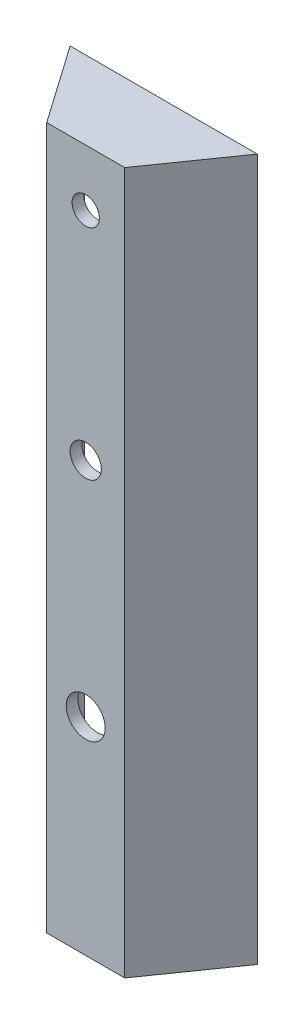
ISO-10303-21;
HEADER;
FILE_DESCRIPTION(('STEP AP214'),'2;1');
FILE_NAME('part.step','',(''),(''),'','','');
FILE_SCHEMA(('AUTOMOTIVE_DESIGN { 1 0 10303 214 1 1 1 1 }'));
ENDSEC;
DATA;
#1=APPLICATION_CONTEXT('core data for automotive mechanical design processes');
#2=APPLICATION_PROTOCOL_DEFINITION('international standard','automotive_design',2000,#1);
#3=PRODUCT_CONTEXT('',#1,'mechanical');
#4=PRODUCT('Part','Part','',(#3));
#5=PRODUCT_RELATED_PRODUCT_CATEGORY('part','',(#4));
#6=PRODUCT_DEFINITION_FORMATION('','',#4);
#7=PRODUCT_DEFINITION_CONTEXT('part definition',#1,'design');
#8=PRODUCT_DEFINITION('design','',#6,#7);
#9=PRODUCT_DEFINITION_SHAPE('','',#8);
#10=(LENGTH_UNIT() NAMED_UNIT(*) SI_UNIT(.MILLI.,.METRE.));
#11=(NAMED_UNIT(*) PLANE_ANGLE_UNIT() SI_UNIT($,.RADIAN.));
#12=(NAMED_UNIT(*) SI_UNIT($,.STERADIAN.) SOLID_ANGLE_UNIT());
#13=UNCERTAINTY_MEASURE_WITH_UNIT(LENGTH_MEASURE(1.E-05),#10,'distance_accuracy_value','');
#14=(GEOMETRIC_REPRESENTATION_CONTEXT(3) GLOBAL_UNCERTAINTY_ASSIGNED_CONTEXT((#13)) GLOBAL_UNIT_ASSIGNED_CONTEXT((#10,
#11,#12)) REPRESENTATION_CONTEXT('',''));
#15=CARTESIAN_POINT('',(0.,0.,0.));
#16=DIRECTION('',(0.,0.,1.));
#17=DIRECTION('',(1.,0.,0.));
#18=AXIS2_PLACEMENT_3D('',#15,#16,#17);
#19=CARTESIAN_POINT('',(-304.8,2286.,0.));
#20=DIRECTION('',(0.,0.,1.));
#21=DIRECTION('',(1.,0.,0.));
#22=AXIS2_PLACEMENT_3D('',#19,#20,#21);
#23=PLANE('',#22);
#24=DIRECTION('',(-1.,0.,0.));
#25=VECTOR('',#24,1.);
#26=CARTESIAN_POINT('',(-304.8,0.,0.));
#27=LINE('',#26,#25);
#28=CARTESIAN_POINT('',(304.8,0.,-1.11981703314034E-13));
#29=VERTEX_POINT('',#28);
#30=CARTESIAN_POINT('',(-304.8,0.,0.));
#31=VERTEX_POINT('',#30);
#32=EDGE_CURVE('E187',#29,#31,#27,.T.);
#33=ORIENTED_EDGE('',*,*,#32,.T.);
#34=DIRECTION('',(0.,-1.,0.));
#35=VECTOR('',#34,1.);
#36=CARTESIAN_POINT('',(-304.8,2286.,0.));
#37=LINE('',#36,#35);
#38=CARTESIAN_POINT('',(-304.8,2286.,0.));
#39=VERTEX_POINT('',#38);
#40=EDGE_CURVE('E49',#39,#31,#37,.T.);
#41=ORIENTED_EDGE('',*,*,#40,.F.);
#42=DIRECTION('',(-1.,0.,0.));
#43=VECTOR('',#42,1.);
#44=CARTESIAN_POINT('',(-304.8,2286.,0.));
#45=LINE('',#44,#43);
#46=CARTESIAN_POINT('',(304.8,2286.,-1.11981703314034E-13));
#47=VERTEX_POINT('',#46);
#48=EDGE_CURVE('E94',#47,#39,#45,.T.);
#49=ORIENTED_EDGE('',*,*,#48,.F.);
#50=DIRECTION('',(0.,-1.,0.));
#51=VECTOR('',#50,1.);
#52=CARTESIAN_POINT('',(304.8,2286.,-1.11981703314034E-13));
#53=LINE('',#52,#51);
#54=EDGE_CURVE('E11',#47,#29,#53,.T.);
#55=ORIENTED_EDGE('',*,*,#54,.T.);
#56=EDGE_LOOP('',(#33,#41,#49,#55));
#57=FACE_BOUND('',#56,.T.);
#58=DIRECTION('',(-1.,0.,0.));
#59=VECTOR('',#58,1.);
#60=CARTESIAN_POINT('',(0.,38.1,0.));
#61=LINE('',#60,#59);
#62=CARTESIAN_POINT('',(258.293023104055,38.1,-1.03438510254988E-13));
#63=VERTEX_POINT('',#62);
#64=CARTESIAN_POINT('',(-258.293023104055,38.1,0.));
#65=VERTEX_POINT('',#64);
#66=EDGE_CURVE('E141',#63,#65,#61,.T.);
#67=ORIENTED_EDGE('',*,*,#66,.F.);
#68=DIRECTION('',(0.,-1.,0.));
#69=VECTOR('',#68,1.);
#70=CARTESIAN_POINT('',(258.293023104055,2286.,-1.03438510254988E-13));
#71=LINE('',#70,#69);
#72=CARTESIAN_POINT('',(258.293023104055,2247.9,-1.03438510254988E-13));
#73=VERTEX_POINT('',#72);
#74=EDGE_CURVE('E139',#73,#63,#71,.T.);
#75=ORIENTED_EDGE('',*,*,#74,.F.);
#76=DIRECTION('',(-1.,0.,0.));
#77=VECTOR('',#76,1.);
#78=CARTESIAN_POINT('',(0.,2247.9,0.));
#79=LINE('',#78,#77);
#80=CARTESIAN_POINT('',(-258.293023104055,2247.9,0.));
#81=VERTEX_POINT('',#80);
#82=EDGE_CURVE('E152',#73,#81,#79,.T.);
#83=ORIENTED_EDGE('',*,*,#82,.T.);
#84=DIRECTION('',(0.,-1.,0.));
#85=VECTOR('',#84,1.);
#86=CARTESIAN_POINT('',(-258.293023104055,2286.,0.));
#87=LINE('',#86,#85);
#88=EDGE_CURVE('E159',#81,#65,#87,.T.);
#89=ORIENTED_EDGE('',*,*,#88,.T.);
#90=EDGE_LOOP('',(#67,#75,#83,#89));
#91=FACE_BOUND('',#90,.T.);
#92=ADVANCED_FACE('F39',(#57,#91),#23,.F.);
#93=CARTESIAN_POINT('',(304.8,2286.,-1.11981703314034E-13));
#94=DIRECTION('',(-0.819231920519041,0.,-0.573462344363328));
#95=DIRECTION('',(-0.573462344363328,0.,0.819231920519041));
#96=AXIS2_PLACEMENT_3D('',#93,#94,#95);
#97=PLANE('',#96);
#98=DIRECTION('',(0.573462344363328,0.,-0.819231920519041));
#99=VECTOR('',#98,1.);
#100=CARTESIAN_POINT('',(304.8,0.,-1.11981703314034E-13));
#101=LINE('',#100,#99);
#102=CARTESIAN_POINT('',(127.,0.,254.));
#103=VERTEX_POINT('',#102);
#104=EDGE_CURVE('E165',#103,#29,#101,.T.);
#105=ORIENTED_EDGE('',*,*,#104,.T.);
#106=ORIENTED_EDGE('',*,*,#54,.F.);
#107=DIRECTION('',(0.573462344363328,0.,-0.819231920519041));
#108=VECTOR('',#107,1.);
#109=CARTESIAN_POINT('',(304.8,2286.,-1.11981703314034E-13));
#110=LINE('',#109,#108);
#111=CARTESIAN_POINT('',(127.,2286.,254.));
#112=VERTEX_POINT('',#111);
#113=EDGE_CURVE('E173',#112,#47,#110,.T.);
#114=ORIENTED_EDGE('',*,*,#113,.F.);
#115=DIRECTION('',(0.,-1.,0.));
#116=VECTOR('',#115,1.);
#117=CARTESIAN_POINT('',(127.,2286.,254.));
#118=LINE('',#117,#116);
#119=EDGE_CURVE('E183',#112,#103,#118,.T.);
#120=ORIENTED_EDGE('',*,*,#119,.T.);
#121=EDGE_LOOP('',(#105,#106,#114,#120));
#122=FACE_BOUND('',#121,.T.);
#123=ADVANCED_FACE('F41',(#122),#97,.F.);
#124=CARTESIAN_POINT('',(-127.,2286.,254.));
#125=DIRECTION('',(0.81923192051904,0.,-0.573462344363328));
#126=DIRECTION('',(-0.573462344363328,0.,-0.81923192051904));
#127=AXIS2_PLACEMENT_3D('',#124,#125,#126);
#128=PLANE('',#127);
#129=DIRECTION('',(0.573462344363328,0.,0.81923192051904));
#130=VECTOR('',#129,1.);
#131=CARTESIAN_POINT('',(-127.,0.,254.));
#132=LINE('',#131,#130);
#133=CARTESIAN_POINT('',(-127.,0.,254.));
#134=VERTEX_POINT('',#133);
#135=EDGE_CURVE('E190',#31,#134,#132,.T.);
#136=ORIENTED_EDGE('',*,*,#135,.T.);
#137=DIRECTION('',(0.,-1.,0.));
#138=VECTOR('',#137,1.);
#139=CARTESIAN_POINT('',(-127.,2286.,254.));
#140=LINE('',#139,#138);
#141=CARTESIAN_POINT('',(-127.,2286.,254.));
#142=VERTEX_POINT('',#141);
#143=EDGE_CURVE('E197',#142,#134,#140,.T.);
#144=ORIENTED_EDGE('',*,*,#143,.F.);
#145=DIRECTION('',(0.573462344363328,0.,0.81923192051904));
#146=VECTOR('',#145,1.);
#147=CARTESIAN_POINT('',(-127.,2286.,254.));
#148=LINE('',#147,#146);
#149=EDGE_CURVE('E178',#39,#142,#148,.T.);
#150=ORIENTED_EDGE('',*,*,#149,.F.);
#151=ORIENTED_EDGE('',*,*,#40,.T.);
#152=EDGE_LOOP('',(#136,#144,#150,#151));
#153=FACE_BOUND('',#152,.T.);
#154=ADVANCED_FACE('F240',(#153),#128,.F.);
#155=CARTESIAN_POINT('',(127.,2286.,254.));
#156=DIRECTION('',(0.,0.,-1.));
#157=DIRECTION('',(-1.,0.,0.));
#158=AXIS2_PLACEMENT_3D('',#155,#156,#157);
#159=PLANE('',#158);
#160=CARTESIAN_POINT('',(0.,2101.85,254.));
#161=DIRECTION('',(0.,0.,-1.));
#162=DIRECTION('',(-1.,0.,0.));
#163=AXIS2_PLACEMENT_3D('',#160,#161,#162);
#164=CIRCLE('',#163,44.4500000000002);
#165=CARTESIAN_POINT('',(-44.4500000000001,2101.85,254.));
#166=VERTEX_POINT('',#165);
#167=EDGE_CURVE('E142',#166,#166,#164,.T.);
#168=ORIENTED_EDGE('',*,*,#167,.T.);
#169=EDGE_LOOP('',(#168));
#170=FACE_BOUND('',#169,.T.);
#171=CARTESIAN_POINT('',(1.64382251675458E-13,1397.,254.));
#172=DIRECTION('',(0.,0.,-1.));
#173=DIRECTION('',(-1.,0.,0.));
#174=AXIS2_PLACEMENT_3D('',#171,#172,#173);
#175=CIRCLE('',#174,50.8);
#176=CARTESIAN_POINT('',(-50.7999999999998,1397.,254.));
#177=VERTEX_POINT('',#176);
#178=EDGE_CURVE('E210',#177,#177,#175,.T.);
#179=ORIENTED_EDGE('',*,*,#178,.T.);
#180=EDGE_LOOP('',(#179));
#181=FACE_BOUND('',#180,.T.);
#182=CARTESIAN_POINT('',(2.53034433465734E-13,673.1,254.));
#183=DIRECTION('',(0.,0.,-1.));
#184=DIRECTION('',(-1.,0.,0.));
#185=AXIS2_PLACEMENT_3D('',#182,#183,#184);
#186=CIRCLE('',#185,63.5);
#187=CARTESIAN_POINT('',(-63.4999999999998,673.1,254.));
#188=VERTEX_POINT('',#187);
#189=EDGE_CURVE('E206',#188,#188,#186,.T.);
#190=ORIENTED_EDGE('',*,*,#189,.T.);
#191=EDGE_LOOP('',(#190));
#192=FACE_BOUND('',#191,.T.);
#193=DIRECTION('',(1.,0.,0.));
#194=VECTOR('',#193,1.);
#195=CARTESIAN_POINT('',(127.,0.,254.));
#196=LINE('',#195,#194);
#197=EDGE_CURVE('E87',#134,#103,#196,.T.);
#198=ORIENTED_EDGE('',*,*,#197,.T.);
#199=ORIENTED_EDGE('',*,*,#119,.F.);
#200=DIRECTION('',(1.,0.,0.));
#201=VECTOR('',#200,1.);
#202=CARTESIAN_POINT('',(127.,2286.,254.));
#203=LINE('',#202,#201);
#204=EDGE_CURVE('E66',#142,#112,#203,.T.);
#205=ORIENTED_EDGE('',*,*,#204,.F.);
#206=ORIENTED_EDGE('',*,*,#143,.T.);
#207=EDGE_LOOP('',(#198,#199,#205,#206));
#208=FACE_BOUND('',#207,.T.);
#209=ADVANCED_FACE('F220',(#170,#181,#192,#208),#159,.F.);
#210=CARTESIAN_POINT('',(0.,2286.,0.));
#211=DIRECTION('',(0.,-1.,0.));
#212=DIRECTION('',(0.,0.,-1.));
#213=AXIS2_PLACEMENT_3D('',#210,#211,#212);
#214=PLANE('',#213);
#215=ORIENTED_EDGE('',*,*,#113,.T.);
#216=ORIENTED_EDGE('',*,*,#48,.T.);
#217=ORIENTED_EDGE('',*,*,#149,.T.);
#218=ORIENTED_EDGE('',*,*,#204,.T.);
#219=EDGE_LOOP('',(#215,#216,#217,#218));
#220=FACE_BOUND('',#219,.T.);
#221=ADVANCED_FACE('F249',(#220),#214,.F.);
#222=CARTESIAN_POINT('',(0.,0.,0.));
#223=DIRECTION('',(0.,-1.,0.));
#224=DIRECTION('',(0.,0.,-1.));
#225=AXIS2_PLACEMENT_3D('',#222,#223,#224);
#226=PLANE('',#225);
#227=ORIENTED_EDGE('',*,*,#104,.F.);
#228=ORIENTED_EDGE('',*,*,#197,.F.);
#229=ORIENTED_EDGE('',*,*,#135,.F.);
#230=ORIENTED_EDGE('',*,*,#32,.F.);
#231=EDGE_LOOP('',(#227,#228,#229,#230));
#232=FACE_BOUND('',#231,.T.);
#233=ADVANCED_FACE('F251',(#232),#226,.T.);
#234=CARTESIAN_POINT('',(273.587263828225,2286.,-21.8489153202429));
#235=DIRECTION('',(-0.819231920519041,0.,-0.573462344363328));
#236=DIRECTION('',(-0.573462344363328,0.,0.819231920519041));
#237=AXIS2_PLACEMENT_3D('',#234,#235,#236);
#238=PLANE('',#237);
#239=DIRECTION('',(0.573462344363328,0.,-0.819231920519041));
#240=VECTOR('',#239,1.);
#241=CARTESIAN_POINT('',(173.351022217486,38.1,121.34571555224));
#242=LINE('',#241,#240);
#243=CARTESIAN_POINT('',(107.163023104055,38.1,215.9));
#244=VERTEX_POINT('',#243);
#245=EDGE_CURVE('E121',#244,#63,#242,.T.);
#246=ORIENTED_EDGE('',*,*,#245,.F.);
#247=DIRECTION('',(0.,-1.,0.));
#248=VECTOR('',#247,1.);
#249=CARTESIAN_POINT('',(107.163023104055,2286.,215.9));
#250=LINE('',#249,#248);
#251=CARTESIAN_POINT('',(107.163023104055,2247.9,215.9));
#252=VERTEX_POINT('',#251);
#253=EDGE_CURVE('E130',#252,#244,#250,.T.);
#254=ORIENTED_EDGE('',*,*,#253,.F.);
#255=DIRECTION('',(0.573462344363328,0.,-0.819231920519041));
#256=VECTOR('',#255,1.);
#257=CARTESIAN_POINT('',(173.351022217486,2247.9,121.34571555224));
#258=LINE('',#257,#256);
#259=EDGE_CURVE('E57',#252,#73,#258,.T.);
#260=ORIENTED_EDGE('',*,*,#259,.T.);
#261=ORIENTED_EDGE('',*,*,#74,.T.);
#262=EDGE_LOOP('',(#246,#254,#260,#261));
#263=FACE_BOUND('',#262,.T.);
#264=ADVANCED_FACE('F137',(#263),#238,.T.);
#265=CARTESIAN_POINT('',(-95.7872638282245,2286.,232.151084679757));
#266=DIRECTION('',(0.81923192051904,0.,-0.573462344363328));
#267=DIRECTION('',(-0.573462344363328,0.,-0.81923192051904));
#268=AXIS2_PLACEMENT_3D('',#265,#266,#267);
#269=PLANE('',#268);
#270=DIRECTION('',(0.573462344363328,0.,0.81923192051904));
#271=VECTOR('',#270,1.);
#272=CARTESIAN_POINT('',(-173.351022217486,38.1,121.34571555224));
#273=LINE('',#272,#271);
#274=CARTESIAN_POINT('',(-107.163023104055,38.1,215.9));
#275=VERTEX_POINT('',#274);
#276=EDGE_CURVE('E124',#65,#275,#273,.T.);
#277=ORIENTED_EDGE('',*,*,#276,.F.);
#278=ORIENTED_EDGE('',*,*,#88,.F.);
#279=DIRECTION('',(0.573462344363328,0.,0.81923192051904));
#280=VECTOR('',#279,1.);
#281=CARTESIAN_POINT('',(-173.351022217486,2247.9,121.34571555224));
#282=LINE('',#281,#280);
#283=CARTESIAN_POINT('',(-107.163023104055,2247.9,215.9));
#284=VERTEX_POINT('',#283);
#285=EDGE_CURVE('E156',#81,#284,#282,.T.);
#286=ORIENTED_EDGE('',*,*,#285,.T.);
#287=DIRECTION('',(0.,-1.,0.));
#288=VECTOR('',#287,1.);
#289=CARTESIAN_POINT('',(-107.163023104055,2286.,215.9));
#290=LINE('',#289,#288);
#291=EDGE_CURVE('E135',#284,#275,#290,.T.);
#292=ORIENTED_EDGE('',*,*,#291,.T.);
#293=EDGE_LOOP('',(#277,#278,#286,#292));
#294=FACE_BOUND('',#293,.T.);
#295=ADVANCED_FACE('F262',(#294),#269,.T.);
#296=CARTESIAN_POINT('',(127.,2286.,215.9));
#297=DIRECTION('',(0.,0.,-1.));
#298=DIRECTION('',(-1.,0.,0.));
#299=AXIS2_PLACEMENT_3D('',#296,#297,#298);
#300=PLANE('',#299);
#301=CARTESIAN_POINT('',(0.,2101.85,215.9));
#302=DIRECTION('',(0.,0.,-1.));
#303=DIRECTION('',(-1.,0.,0.));
#304=AXIS2_PLACEMENT_3D('',#301,#302,#303);
#305=CIRCLE('',#304,44.4500000000002);
#306=CARTESIAN_POINT('',(-44.4500000000001,2101.85,215.9));
#307=VERTEX_POINT('',#306);
#308=EDGE_CURVE('E43',#307,#307,#305,.T.);
#309=ORIENTED_EDGE('',*,*,#308,.F.);
#310=EDGE_LOOP('',(#309));
#311=FACE_BOUND('',#310,.T.);
#312=CARTESIAN_POINT('',(1.64382251675458E-13,1397.,215.9));
#313=DIRECTION('',(0.,0.,-1.));
#314=DIRECTION('',(-1.,0.,0.));
#315=AXIS2_PLACEMENT_3D('',#312,#313,#314);
#316=CIRCLE('',#315,50.8);
#317=CARTESIAN_POINT('',(-50.7999999999998,1397.,215.9));
#318=VERTEX_POINT('',#317);
#319=EDGE_CURVE('E207',#318,#318,#316,.T.);
#320=ORIENTED_EDGE('',*,*,#319,.F.);
#321=EDGE_LOOP('',(#320));
#322=FACE_BOUND('',#321,.T.);
#323=CARTESIAN_POINT('',(2.53034433465734E-13,673.1,215.9));
#324=DIRECTION('',(0.,0.,-1.));
#325=DIRECTION('',(-1.,0.,0.));
#326=AXIS2_PLACEMENT_3D('',#323,#324,#325);
#327=CIRCLE('',#326,63.5);
#328=CARTESIAN_POINT('',(-63.4999999999998,673.1,215.9));
#329=VERTEX_POINT('',#328);
#330=EDGE_CURVE('E203',#329,#329,#327,.T.);
#331=ORIENTED_EDGE('',*,*,#330,.F.);
#332=EDGE_LOOP('',(#331));
#333=FACE_BOUND('',#332,.T.);
#334=DIRECTION('',(1.,0.,0.));
#335=VECTOR('',#334,1.);
#336=CARTESIAN_POINT('',(0.,38.1,215.9));
#337=LINE('',#336,#335);
#338=EDGE_CURVE('E117',#275,#244,#337,.T.);
#339=ORIENTED_EDGE('',*,*,#338,.F.);
#340=ORIENTED_EDGE('',*,*,#291,.F.);
#341=DIRECTION('',(1.,0.,0.));
#342=VECTOR('',#341,1.);
#343=CARTESIAN_POINT('',(0.,2247.9,215.9));
#344=LINE('',#343,#342);
#345=EDGE_CURVE('E133',#284,#252,#344,.T.);
#346=ORIENTED_EDGE('',*,*,#345,.T.);
#347=ORIENTED_EDGE('',*,*,#253,.T.);
#348=EDGE_LOOP('',(#339,#340,#346,#347));
#349=FACE_BOUND('',#348,.T.);
#350=ADVANCED_FACE('F131',(#311,#322,#333,#349),#300,.T.);
#351=CARTESIAN_POINT('',(0.,2247.9,0.));
#352=DIRECTION('',(0.,-1.,0.));
#353=DIRECTION('',(0.,0.,-1.));
#354=AXIS2_PLACEMENT_3D('',#351,#352,#353);
#355=PLANE('',#354);
#356=ORIENTED_EDGE('',*,*,#259,.F.);
#357=ORIENTED_EDGE('',*,*,#345,.F.);
#358=ORIENTED_EDGE('',*,*,#285,.F.);
#359=ORIENTED_EDGE('',*,*,#82,.F.);
#360=EDGE_LOOP('',(#356,#357,#358,#359));
#361=FACE_BOUND('',#360,.T.);
#362=ADVANCED_FACE('F233',(#361),#355,.T.);
#363=CARTESIAN_POINT('',(0.,38.1,0.));
#364=DIRECTION('',(0.,-1.,0.));
#365=DIRECTION('',(0.,0.,-1.));
#366=AXIS2_PLACEMENT_3D('',#363,#364,#365);
#367=PLANE('',#366);
#368=ORIENTED_EDGE('',*,*,#245,.T.);
#369=ORIENTED_EDGE('',*,*,#66,.T.);
#370=ORIENTED_EDGE('',*,*,#276,.T.);
#371=ORIENTED_EDGE('',*,*,#338,.T.);
#372=EDGE_LOOP('',(#368,#369,#370,#371));
#373=FACE_BOUND('',#372,.T.);
#374=ADVANCED_FACE('F119',(#373),#367,.F.);
#375=CARTESIAN_POINT('',(2.53034433465734E-13,673.1,-1.11022302462516E-13));
#376=DIRECTION('',(0.,0.,1.));
#377=DIRECTION('',(1.,0.,0.));
#378=AXIS2_PLACEMENT_3D('',#375,#376,#377);
#379=CYLINDRICAL_SURFACE('',#378,63.5);
#380=ORIENTED_EDGE('',*,*,#330,.T.);
#381=EDGE_LOOP('',(#380));
#382=FACE_BOUND('',#381,.T.);
#383=ORIENTED_EDGE('',*,*,#189,.F.);
#384=EDGE_LOOP('',(#383));
#385=FACE_BOUND('',#384,.T.);
#386=ADVANCED_FACE('F222',(#382,#385),#379,.F.);
#387=CARTESIAN_POINT('',(1.64382251675458E-13,1397.,-1.11022302462516E-13));
#388=DIRECTION('',(0.,0.,1.));
#389=DIRECTION('',(1.,0.,0.));
#390=AXIS2_PLACEMENT_3D('',#387,#388,#389);
#391=CYLINDRICAL_SURFACE('',#390,50.8);
#392=ORIENTED_EDGE('',*,*,#319,.T.);
#393=EDGE_LOOP('',(#392));
#394=FACE_BOUND('',#393,.T.);
#395=ORIENTED_EDGE('',*,*,#178,.F.);
#396=EDGE_LOOP('',(#395));
#397=FACE_BOUND('',#396,.T.);
#398=ADVANCED_FACE('F224',(#394,#397),#391,.F.);
#399=CARTESIAN_POINT('',(0.,2101.85,-1.11022302462516E-13));
#400=DIRECTION('',(0.,0.,1.));
#401=DIRECTION('',(1.,0.,0.));
#402=AXIS2_PLACEMENT_3D('',#399,#400,#401);
#403=CYLINDRICAL_SURFACE('',#402,44.4500000000002);
#404=ORIENTED_EDGE('',*,*,#308,.T.);
#405=EDGE_LOOP('',(#404));
#406=FACE_BOUND('',#405,.T.);
#407=ORIENTED_EDGE('',*,*,#167,.F.);
#408=EDGE_LOOP('',(#407));
#409=FACE_BOUND('',#408,.T.);
#410=ADVANCED_FACE('F231',(#406,#409),#403,.F.);
#411=CLOSED_SHELL('',(#92,#123,#154,#209,#221,#233,#264,#295,#350,#362,#374,#386,#398,#410));
#412=MANIFOLD_SOLID_BREP('B2',#411);
#413=ADVANCED_BREP_SHAPE_REPRESENTATION('',(#18,#412),#14);
#414=SHAPE_DEFINITION_REPRESENTATION(#9,#413);
ENDSEC;
END-ISO-10303-21;
